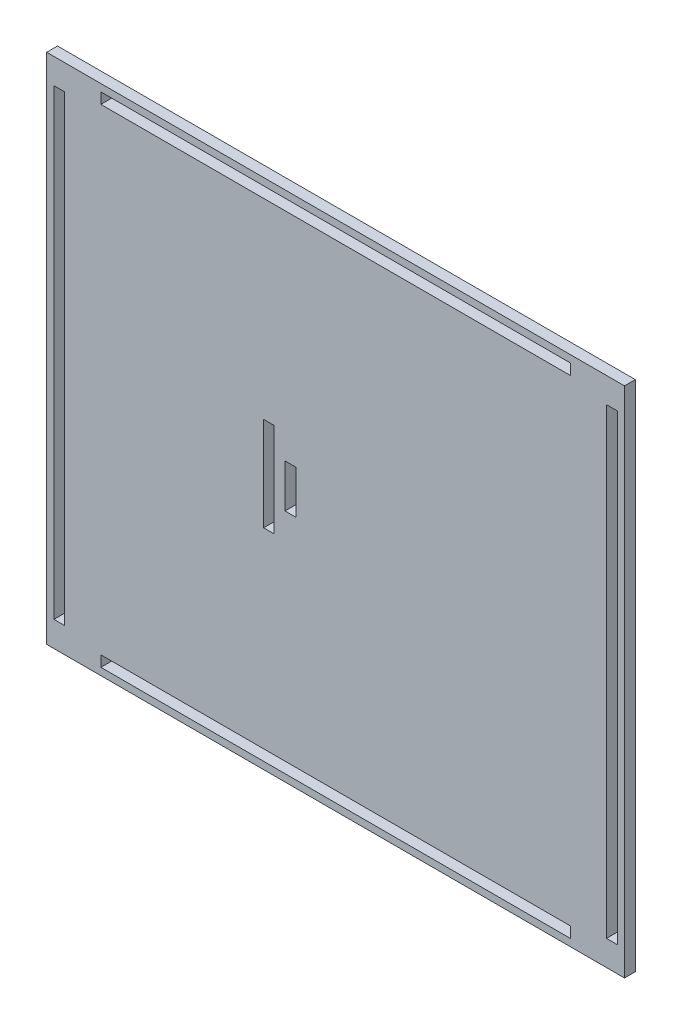
ISO-10303-21;
HEADER;
FILE_DESCRIPTION(('STEP AP214'),'2;1');
FILE_NAME('part.step','',(''),(''),'','','');
FILE_SCHEMA(('AUTOMOTIVE_DESIGN { 1 0 10303 214 1 1 1 1 }'));
ENDSEC;
DATA;
#1=APPLICATION_CONTEXT('core data for automotive mechanical design processes');
#2=APPLICATION_PROTOCOL_DEFINITION('international standard','automotive_design',2000,#1);
#3=PRODUCT_CONTEXT('',#1,'mechanical');
#4=PRODUCT('Part','Part','',(#3));
#5=PRODUCT_RELATED_PRODUCT_CATEGORY('part','',(#4));
#6=PRODUCT_DEFINITION_FORMATION('','',#4);
#7=PRODUCT_DEFINITION_CONTEXT('part definition',#1,'design');
#8=PRODUCT_DEFINITION('design','',#6,#7);
#9=PRODUCT_DEFINITION_SHAPE('','',#8);
#10=(LENGTH_UNIT() NAMED_UNIT(*) SI_UNIT(.MILLI.,.METRE.));
#11=(NAMED_UNIT(*) PLANE_ANGLE_UNIT() SI_UNIT($,.RADIAN.));
#12=(NAMED_UNIT(*) SI_UNIT($,.STERADIAN.) SOLID_ANGLE_UNIT());
#13=UNCERTAINTY_MEASURE_WITH_UNIT(LENGTH_MEASURE(1.E-05),#10,'distance_accuracy_value','');
#14=(GEOMETRIC_REPRESENTATION_CONTEXT(3) GLOBAL_UNCERTAINTY_ASSIGNED_CONTEXT((#13)) GLOBAL_UNIT_ASSIGNED_CONTEXT((#10,
#11,#12)) REPRESENTATION_CONTEXT('',''));
#15=CARTESIAN_POINT('',(0.,0.,0.));
#16=DIRECTION('',(0.,0.,1.));
#17=DIRECTION('',(1.,0.,0.));
#18=AXIS2_PLACEMENT_3D('',#15,#16,#17);
#19=CARTESIAN_POINT('',(0.,0.,3.));
#20=DIRECTION('',(0.,0.,1.));
#21=DIRECTION('',(1.,0.,0.));
#22=AXIS2_PLACEMENT_3D('',#19,#20,#21);
#23=PLANE('',#22);
#24=DIRECTION('',(0.,-1.,0.));
#25=VECTOR('',#24,1.);
#26=CARTESIAN_POINT('',(-78.225474185451,39.1132477538768,3.));
#27=LINE('',#26,#25);
#28=CARTESIAN_POINT('',(-78.225474185451,39.1132477538768,3.));
#29=VERTEX_POINT('',#28);
#30=CARTESIAN_POINT('',(-78.225474185451,-102.886752246123,3.));
#31=VERTEX_POINT('',#30);
#32=EDGE_CURVE('E411',#29,#31,#27,.T.);
#33=ORIENTED_EDGE('',*,*,#32,.T.);
#34=DIRECTION('',(1.,0.,0.));
#35=VECTOR('',#34,1.);
#36=CARTESIAN_POINT('',(-78.225474185451,-102.886752246123,3.));
#37=LINE('',#36,#35);
#38=CARTESIAN_POINT('',(81.7745258145491,-102.886752246123,3.));
#39=VERTEX_POINT('',#38);
#40=EDGE_CURVE('E414',#31,#39,#37,.T.);
#41=ORIENTED_EDGE('',*,*,#40,.T.);
#42=DIRECTION('',(0.,1.,0.));
#43=VECTOR('',#42,1.);
#44=CARTESIAN_POINT('',(81.774525814549,39.1132477538768,3.));
#45=LINE('',#44,#43);
#46=CARTESIAN_POINT('',(81.774525814549,39.1132477538768,3.));
#47=VERTEX_POINT('',#46);
#48=EDGE_CURVE('E417',#39,#47,#45,.T.);
#49=ORIENTED_EDGE('',*,*,#48,.T.);
#50=DIRECTION('',(-1.,0.,0.));
#51=VECTOR('',#50,1.);
#52=CARTESIAN_POINT('',(-78.225474185451,39.1132477538768,3.));
#53=LINE('',#52,#51);
#54=EDGE_CURVE('E419',#47,#29,#53,.T.);
#55=ORIENTED_EDGE('',*,*,#54,.T.);
#56=EDGE_LOOP('',(#33,#41,#49,#55));
#57=FACE_BOUND('',#56,.T.);
#58=DIRECTION('',(1.,0.,0.));
#59=VECTOR('',#58,1.);
#60=CARTESIAN_POINT('',(-63.225474185451,34.1132477538768,3.));
#61=LINE('',#60,#59);
#62=CARTESIAN_POINT('',(-63.225474185451,34.1132477538768,3.));
#63=VERTEX_POINT('',#62);
#64=CARTESIAN_POINT('',(66.774525814549,34.1132477538768,3.));
#65=VERTEX_POINT('',#64);
#66=EDGE_CURVE('E382',#63,#65,#61,.T.);
#67=ORIENTED_EDGE('',*,*,#66,.F.);
#68=DIRECTION('',(0.,-1.,0.));
#69=VECTOR('',#68,1.);
#70=CARTESIAN_POINT('',(-63.225474185451,37.1132477538768,3.));
#71=LINE('',#70,#69);
#72=CARTESIAN_POINT('',(-63.225474185451,37.1132477538768,3.));
#73=VERTEX_POINT('',#72);
#74=EDGE_CURVE('E380',#73,#63,#71,.T.);
#75=ORIENTED_EDGE('',*,*,#74,.F.);
#76=DIRECTION('',(-1.,0.,0.));
#77=VECTOR('',#76,1.);
#78=CARTESIAN_POINT('',(-63.225474185451,37.1132477538768,3.));
#79=LINE('',#78,#77);
#80=CARTESIAN_POINT('',(66.774525814549,37.1132477538768,3.));
#81=VERTEX_POINT('',#80);
#82=EDGE_CURVE('E388',#81,#73,#79,.T.);
#83=ORIENTED_EDGE('',*,*,#82,.F.);
#84=DIRECTION('',(0.,1.,0.));
#85=VECTOR('',#84,1.);
#86=CARTESIAN_POINT('',(66.774525814549,37.1132477538768,3.));
#87=LINE('',#86,#85);
#88=EDGE_CURVE('E385',#65,#81,#87,.T.);
#89=ORIENTED_EDGE('',*,*,#88,.F.);
#90=EDGE_LOOP('',(#67,#75,#83,#89));
#91=FACE_BOUND('',#90,.T.);
#92=DIRECTION('',(1.,0.,0.));
#93=VECTOR('',#92,1.);
#94=CARTESIAN_POINT('',(-63.225474185451,-100.886752246123,3.));
#95=LINE('',#94,#93);
#96=CARTESIAN_POINT('',(-63.225474185451,-100.886752246123,3.));
#97=VERTEX_POINT('',#96);
#98=CARTESIAN_POINT('',(66.774525814549,-100.886752246123,3.));
#99=VERTEX_POINT('',#98);
#100=EDGE_CURVE('E351',#97,#99,#95,.T.);
#101=ORIENTED_EDGE('',*,*,#100,.F.);
#102=DIRECTION('',(0.,-1.,0.));
#103=VECTOR('',#102,1.);
#104=CARTESIAN_POINT('',(-63.225474185451,-100.886752246123,3.));
#105=LINE('',#104,#103);
#106=CARTESIAN_POINT('',(-63.225474185451,-97.8867522461232,3.));
#107=VERTEX_POINT('',#106);
#108=EDGE_CURVE('E349',#107,#97,#105,.T.);
#109=ORIENTED_EDGE('',*,*,#108,.F.);
#110=DIRECTION('',(-1.,0.,0.));
#111=VECTOR('',#110,1.);
#112=CARTESIAN_POINT('',(-63.225474185451,-97.8867522461232,3.));
#113=LINE('',#112,#111);
#114=CARTESIAN_POINT('',(66.774525814549,-97.8867522461232,3.));
#115=VERTEX_POINT('',#114);
#116=EDGE_CURVE('E357',#115,#107,#113,.T.);
#117=ORIENTED_EDGE('',*,*,#116,.F.);
#118=DIRECTION('',(0.,1.,0.));
#119=VECTOR('',#118,1.);
#120=CARTESIAN_POINT('',(66.774525814549,-100.886752246123,3.));
#121=LINE('',#120,#119);
#122=EDGE_CURVE('E354',#99,#115,#121,.T.);
#123=ORIENTED_EDGE('',*,*,#122,.F.);
#124=EDGE_LOOP('',(#101,#109,#117,#123));
#125=FACE_BOUND('',#124,.T.);
#126=DIRECTION('',(1.,0.,0.));
#127=VECTOR('',#126,1.);
#128=CARTESIAN_POINT('',(-76.225474185451,-95.8867522461232,3.));
#129=LINE('',#128,#127);
#130=CARTESIAN_POINT('',(-76.225474185451,-95.8867522461232,3.));
#131=VERTEX_POINT('',#130);
#132=CARTESIAN_POINT('',(-73.225474185451,-95.8867522461232,3.));
#133=VERTEX_POINT('',#132);
#134=EDGE_CURVE('E320',#131,#133,#129,.T.);
#135=ORIENTED_EDGE('',*,*,#134,.F.);
#136=DIRECTION('',(0.,-1.,0.));
#137=VECTOR('',#136,1.);
#138=CARTESIAN_POINT('',(-76.225474185451,32.1132477538768,3.));
#139=LINE('',#138,#137);
#140=CARTESIAN_POINT('',(-76.225474185451,32.1132477538768,3.));
#141=VERTEX_POINT('',#140);
#142=EDGE_CURVE('E318',#141,#131,#139,.T.);
#143=ORIENTED_EDGE('',*,*,#142,.F.);
#144=DIRECTION('',(-1.,0.,0.));
#145=VECTOR('',#144,1.);
#146=CARTESIAN_POINT('',(-76.225474185451,32.1132477538768,3.));
#147=LINE('',#146,#145);
#148=CARTESIAN_POINT('',(-73.225474185451,32.1132477538768,3.));
#149=VERTEX_POINT('',#148);
#150=EDGE_CURVE('E326',#149,#141,#147,.T.);
#151=ORIENTED_EDGE('',*,*,#150,.F.);
#152=DIRECTION('',(0.,1.,0.));
#153=VECTOR('',#152,1.);
#154=CARTESIAN_POINT('',(-73.225474185451,32.1132477538768,3.));
#155=LINE('',#154,#153);
#156=EDGE_CURVE('E323',#133,#149,#155,.T.);
#157=ORIENTED_EDGE('',*,*,#156,.F.);
#158=EDGE_LOOP('',(#135,#143,#151,#157));
#159=FACE_BOUND('',#158,.T.);
#160=DIRECTION('',(-1.,0.,0.));
#161=VECTOR('',#160,1.);
#162=CARTESIAN_POINT('',(79.774525814549,32.1132477538773,3.));
#163=LINE('',#162,#161);
#164=CARTESIAN_POINT('',(79.774525814549,32.1132477538773,3.));
#165=VERTEX_POINT('',#164);
#166=CARTESIAN_POINT('',(76.7745258145564,32.1132477538773,3.));
#167=VERTEX_POINT('',#166);
#168=EDGE_CURVE('E289',#165,#167,#163,.T.);
#169=ORIENTED_EDGE('',*,*,#168,.F.);
#170=DIRECTION('',(0.,1.,0.));
#171=VECTOR('',#170,1.);
#172=CARTESIAN_POINT('',(79.774525814549,32.1132477538773,3.));
#173=LINE('',#172,#171);
#174=CARTESIAN_POINT('',(79.774525814549,-95.8867522461226,3.));
#175=VERTEX_POINT('',#174);
#176=EDGE_CURVE('E287',#175,#165,#173,.T.);
#177=ORIENTED_EDGE('',*,*,#176,.F.);
#178=DIRECTION('',(1.,0.,0.));
#179=VECTOR('',#178,1.);
#180=CARTESIAN_POINT('',(79.774525814549,-95.8867522461226,3.));
#181=LINE('',#180,#179);
#182=CARTESIAN_POINT('',(76.7745258145564,-95.8867522461226,3.));
#183=VERTEX_POINT('',#182);
#184=EDGE_CURVE('E295',#183,#175,#181,.T.);
#185=ORIENTED_EDGE('',*,*,#184,.F.);
#186=DIRECTION('',(0.,-1.,0.));
#187=VECTOR('',#186,1.);
#188=CARTESIAN_POINT('',(76.7745258145564,32.1132477538773,3.));
#189=LINE('',#188,#187);
#190=EDGE_CURVE('E292',#167,#183,#189,.T.);
#191=ORIENTED_EDGE('',*,*,#190,.F.);
#192=EDGE_LOOP('',(#169,#177,#185,#191));
#193=FACE_BOUND('',#192,.T.);
#194=DIRECTION('',(1.,0.,0.));
#195=VECTOR('',#194,1.);
#196=CARTESIAN_POINT('',(-18.1451342269902,-44.8867522461232,3.));
#197=LINE('',#196,#195);
#198=CARTESIAN_POINT('',(-18.1451342269902,-44.8867522461232,3.));
#199=VERTEX_POINT('',#198);
#200=CARTESIAN_POINT('',(-15.225474185451,-44.8867522461232,3.));
#201=VERTEX_POINT('',#200);
#202=EDGE_CURVE('E258',#199,#201,#197,.T.);
#203=ORIENTED_EDGE('',*,*,#202,.F.);
#204=DIRECTION('',(0.,-1.,0.));
#205=VECTOR('',#204,1.);
#206=CARTESIAN_POINT('',(-18.1451342269902,-18.8867522461232,3.));
#207=LINE('',#206,#205);
#208=CARTESIAN_POINT('',(-18.1451342269902,-18.8867522461232,3.));
#209=VERTEX_POINT('',#208);
#210=EDGE_CURVE('E256',#209,#199,#207,.T.);
#211=ORIENTED_EDGE('',*,*,#210,.F.);
#212=DIRECTION('',(-1.,0.,0.));
#213=VECTOR('',#212,1.);
#214=CARTESIAN_POINT('',(-18.1451342269902,-18.8867522461232,3.));
#215=LINE('',#214,#213);
#216=CARTESIAN_POINT('',(-15.225474185451,-18.8867522461232,3.));
#217=VERTEX_POINT('',#216);
#218=EDGE_CURVE('E264',#217,#209,#215,.T.);
#219=ORIENTED_EDGE('',*,*,#218,.F.);
#220=DIRECTION('',(0.,1.,0.));
#221=VECTOR('',#220,1.);
#222=CARTESIAN_POINT('',(-15.225474185451,-18.8867522461232,3.));
#223=LINE('',#222,#221);
#224=EDGE_CURVE('E261',#201,#217,#223,.T.);
#225=ORIENTED_EDGE('',*,*,#224,.F.);
#226=EDGE_LOOP('',(#203,#211,#219,#225));
#227=FACE_BOUND('',#226,.T.);
#228=DIRECTION('',(1.,0.,0.));
#229=VECTOR('',#228,1.);
#230=CARTESIAN_POINT('',(-12.225474185451,-37.8867522461232,3.));
#231=LINE('',#230,#229);
#232=CARTESIAN_POINT('',(-12.225474185451,-37.8867522461232,3.));
#233=VERTEX_POINT('',#232);
#234=CARTESIAN_POINT('',(-9.22547418545098,-37.8867522461232,3.));
#235=VERTEX_POINT('',#234);
#236=EDGE_CURVE('E228',#233,#235,#231,.T.);
#237=ORIENTED_EDGE('',*,*,#236,.F.);
#238=DIRECTION('',(0.,-1.,0.));
#239=VECTOR('',#238,1.);
#240=CARTESIAN_POINT('',(-12.225474185451,-25.8867522461232,3.));
#241=LINE('',#240,#239);
#242=CARTESIAN_POINT('',(-12.225474185451,-25.8867522461232,3.));
#243=VERTEX_POINT('',#242);
#244=EDGE_CURVE('E220',#243,#233,#241,.T.);
#245=ORIENTED_EDGE('',*,*,#244,.F.);
#246=DIRECTION('',(-1.,0.,0.));
#247=VECTOR('',#246,1.);
#248=CARTESIAN_POINT('',(-12.225474185451,-25.8867522461232,3.));
#249=LINE('',#248,#247);
#250=CARTESIAN_POINT('',(-9.22547418545098,-25.8867522461232,3.));
#251=VERTEX_POINT('',#250);
#252=EDGE_CURVE('E242',#251,#243,#249,.T.);
#253=ORIENTED_EDGE('',*,*,#252,.F.);
#254=DIRECTION('',(0.,1.,0.));
#255=VECTOR('',#254,1.);
#256=CARTESIAN_POINT('',(-9.22547418545098,-25.8867522461232,3.));
#257=LINE('',#256,#255);
#258=EDGE_CURVE('E240',#235,#251,#257,.T.);
#259=ORIENTED_EDGE('',*,*,#258,.F.);
#260=EDGE_LOOP('',(#237,#245,#253,#259));
#261=FACE_BOUND('',#260,.T.);
#262=ADVANCED_FACE('F35',(#57,#91,#125,#159,#193,#227,#261),#23,.T.);
#263=CARTESIAN_POINT('',(0.,0.,0.));
#264=DIRECTION('',(0.,0.,1.));
#265=DIRECTION('',(1.,0.,0.));
#266=AXIS2_PLACEMENT_3D('',#263,#264,#265);
#267=PLANE('',#266);
#268=DIRECTION('',(0.,-1.,0.));
#269=VECTOR('',#268,1.);
#270=CARTESIAN_POINT('',(-18.1451342269902,-18.8867522461232,0.));
#271=LINE('',#270,#269);
#272=CARTESIAN_POINT('',(-18.1451342269902,-18.8867522461232,0.));
#273=VERTEX_POINT('',#272);
#274=CARTESIAN_POINT('',(-18.1451342269902,-44.8867522461232,0.));
#275=VERTEX_POINT('',#274);
#276=EDGE_CURVE('E236',#273,#275,#271,.T.);
#277=ORIENTED_EDGE('',*,*,#276,.T.);
#278=DIRECTION('',(1.,0.,0.));
#279=VECTOR('',#278,1.);
#280=CARTESIAN_POINT('',(-18.1451342269902,-44.8867522461232,0.));
#281=LINE('',#280,#279);
#282=CARTESIAN_POINT('',(-15.225474185451,-44.8867522461232,0.));
#283=VERTEX_POINT('',#282);
#284=EDGE_CURVE('E269',#275,#283,#281,.T.);
#285=ORIENTED_EDGE('',*,*,#284,.T.);
#286=DIRECTION('',(0.,1.,0.));
#287=VECTOR('',#286,1.);
#288=CARTESIAN_POINT('',(-15.225474185451,-18.8867522461232,0.));
#289=LINE('',#288,#287);
#290=CARTESIAN_POINT('',(-15.225474185451,-18.8867522461232,0.));
#291=VERTEX_POINT('',#290);
#292=EDGE_CURVE('E272',#283,#291,#289,.T.);
#293=ORIENTED_EDGE('',*,*,#292,.T.);
#294=DIRECTION('',(-1.,0.,0.));
#295=VECTOR('',#294,1.);
#296=CARTESIAN_POINT('',(-18.1451342269902,-18.8867522461232,0.));
#297=LINE('',#296,#295);
#298=EDGE_CURVE('E259',#291,#273,#297,.T.);
#299=ORIENTED_EDGE('',*,*,#298,.T.);
#300=EDGE_LOOP('',(#277,#285,#293,#299));
#301=FACE_BOUND('',#300,.T.);
#302=DIRECTION('',(0.,-1.,0.));
#303=VECTOR('',#302,1.);
#304=CARTESIAN_POINT('',(-76.225474185451,32.1132477538768,0.));
#305=LINE('',#304,#303);
#306=CARTESIAN_POINT('',(-76.225474185451,32.1132477538768,0.));
#307=VERTEX_POINT('',#306);
#308=CARTESIAN_POINT('',(-76.225474185451,-95.8867522461232,0.));
#309=VERTEX_POINT('',#308);
#310=EDGE_CURVE('E317',#307,#309,#305,.T.);
#311=ORIENTED_EDGE('',*,*,#310,.T.);
#312=DIRECTION('',(1.,0.,0.));
#313=VECTOR('',#312,1.);
#314=CARTESIAN_POINT('',(-76.225474185451,-95.8867522461232,0.));
#315=LINE('',#314,#313);
#316=CARTESIAN_POINT('',(-73.225474185451,-95.8867522461232,0.));
#317=VERTEX_POINT('',#316);
#318=EDGE_CURVE('E331',#309,#317,#315,.T.);
#319=ORIENTED_EDGE('',*,*,#318,.T.);
#320=DIRECTION('',(0.,1.,0.));
#321=VECTOR('',#320,1.);
#322=CARTESIAN_POINT('',(-73.225474185451,32.1132477538768,0.));
#323=LINE('',#322,#321);
#324=CARTESIAN_POINT('',(-73.225474185451,32.1132477538768,0.));
#325=VERTEX_POINT('',#324);
#326=EDGE_CURVE('E334',#317,#325,#323,.T.);
#327=ORIENTED_EDGE('',*,*,#326,.T.);
#328=DIRECTION('',(-1.,0.,0.));
#329=VECTOR('',#328,1.);
#330=CARTESIAN_POINT('',(-76.225474185451,32.1132477538768,0.));
#331=LINE('',#330,#329);
#332=EDGE_CURVE('E321',#325,#307,#331,.T.);
#333=ORIENTED_EDGE('',*,*,#332,.T.);
#334=EDGE_LOOP('',(#311,#319,#327,#333));
#335=FACE_BOUND('',#334,.T.);
#336=DIRECTION('',(0.,-1.,0.));
#337=VECTOR('',#336,1.);
#338=CARTESIAN_POINT('',(-63.225474185451,37.1132477538768,0.));
#339=LINE('',#338,#337);
#340=CARTESIAN_POINT('',(-63.225474185451,37.1132477538768,0.));
#341=VERTEX_POINT('',#340);
#342=CARTESIAN_POINT('',(-63.225474185451,34.1132477538768,0.));
#343=VERTEX_POINT('',#342);
#344=EDGE_CURVE('E379',#341,#343,#339,.T.);
#345=ORIENTED_EDGE('',*,*,#344,.T.);
#346=DIRECTION('',(1.,0.,0.));
#347=VECTOR('',#346,1.);
#348=CARTESIAN_POINT('',(-63.225474185451,34.1132477538768,0.));
#349=LINE('',#348,#347);
#350=CARTESIAN_POINT('',(66.774525814549,34.1132477538768,0.));
#351=VERTEX_POINT('',#350);
#352=EDGE_CURVE('E393',#343,#351,#349,.T.);
#353=ORIENTED_EDGE('',*,*,#352,.T.);
#354=DIRECTION('',(0.,1.,0.));
#355=VECTOR('',#354,1.);
#356=CARTESIAN_POINT('',(66.774525814549,37.1132477538768,0.));
#357=LINE('',#356,#355);
#358=CARTESIAN_POINT('',(66.774525814549,37.1132477538768,0.));
#359=VERTEX_POINT('',#358);
#360=EDGE_CURVE('E396',#351,#359,#357,.T.);
#361=ORIENTED_EDGE('',*,*,#360,.T.);
#362=DIRECTION('',(-1.,0.,0.));
#363=VECTOR('',#362,1.);
#364=CARTESIAN_POINT('',(-63.225474185451,37.1132477538768,0.));
#365=LINE('',#364,#363);
#366=EDGE_CURVE('E383',#359,#341,#365,.T.);
#367=ORIENTED_EDGE('',*,*,#366,.T.);
#368=EDGE_LOOP('',(#345,#353,#361,#367));
#369=FACE_BOUND('',#368,.T.);
#370=DIRECTION('',(0.,-1.,0.));
#371=VECTOR('',#370,1.);
#372=CARTESIAN_POINT('',(-78.225474185451,39.1132477538768,0.));
#373=LINE('',#372,#371);
#374=CARTESIAN_POINT('',(-78.225474185451,39.1132477538768,0.));
#375=VERTEX_POINT('',#374);
#376=CARTESIAN_POINT('',(-78.225474185451,-102.886752246123,0.));
#377=VERTEX_POINT('',#376);
#378=EDGE_CURVE('E410',#375,#377,#373,.T.);
#379=ORIENTED_EDGE('',*,*,#378,.F.);
#380=DIRECTION('',(-1.,0.,0.));
#381=VECTOR('',#380,1.);
#382=CARTESIAN_POINT('',(-78.225474185451,39.1132477538768,0.));
#383=LINE('',#382,#381);
#384=CARTESIAN_POINT('',(81.774525814549,39.1132477538768,0.));
#385=VERTEX_POINT('',#384);
#386=EDGE_CURVE('E415',#385,#375,#383,.T.);
#387=ORIENTED_EDGE('',*,*,#386,.F.);
#388=DIRECTION('',(0.,1.,0.));
#389=VECTOR('',#388,1.);
#390=CARTESIAN_POINT('',(81.774525814549,39.1132477538768,0.));
#391=LINE('',#390,#389);
#392=CARTESIAN_POINT('',(81.7745258145491,-102.886752246123,0.));
#393=VERTEX_POINT('',#392);
#394=EDGE_CURVE('E426',#393,#385,#391,.T.);
#395=ORIENTED_EDGE('',*,*,#394,.F.);
#396=DIRECTION('',(1.,0.,0.));
#397=VECTOR('',#396,1.);
#398=CARTESIAN_POINT('',(-78.225474185451,-102.886752246123,0.));
#399=LINE('',#398,#397);
#400=EDGE_CURVE('E424',#377,#393,#399,.T.);
#401=ORIENTED_EDGE('',*,*,#400,.F.);
#402=EDGE_LOOP('',(#379,#387,#395,#401));
#403=FACE_BOUND('',#402,.T.);
#404=DIRECTION('',(0.,-1.,0.));
#405=VECTOR('',#404,1.);
#406=CARTESIAN_POINT('',(-63.225474185451,-100.886752246123,0.));
#407=LINE('',#406,#405);
#408=CARTESIAN_POINT('',(-63.225474185451,-97.8867522461232,0.));
#409=VERTEX_POINT('',#408);
#410=CARTESIAN_POINT('',(-63.225474185451,-100.886752246123,0.));
#411=VERTEX_POINT('',#410);
#412=EDGE_CURVE('E348',#409,#411,#407,.T.);
#413=ORIENTED_EDGE('',*,*,#412,.T.);
#414=DIRECTION('',(1.,0.,0.));
#415=VECTOR('',#414,1.);
#416=CARTESIAN_POINT('',(-63.225474185451,-100.886752246123,0.));
#417=LINE('',#416,#415);
#418=CARTESIAN_POINT('',(66.774525814549,-100.886752246123,0.));
#419=VERTEX_POINT('',#418);
#420=EDGE_CURVE('E362',#411,#419,#417,.T.);
#421=ORIENTED_EDGE('',*,*,#420,.T.);
#422=DIRECTION('',(0.,1.,0.));
#423=VECTOR('',#422,1.);
#424=CARTESIAN_POINT('',(66.774525814549,-100.886752246123,0.));
#425=LINE('',#424,#423);
#426=CARTESIAN_POINT('',(66.774525814549,-97.8867522461232,0.));
#427=VERTEX_POINT('',#426);
#428=EDGE_CURVE('E365',#419,#427,#425,.T.);
#429=ORIENTED_EDGE('',*,*,#428,.T.);
#430=DIRECTION('',(-1.,0.,0.));
#431=VECTOR('',#430,1.);
#432=CARTESIAN_POINT('',(-63.225474185451,-97.8867522461232,0.));
#433=LINE('',#432,#431);
#434=EDGE_CURVE('E352',#427,#409,#433,.T.);
#435=ORIENTED_EDGE('',*,*,#434,.T.);
#436=EDGE_LOOP('',(#413,#421,#429,#435));
#437=FACE_BOUND('',#436,.T.);
#438=DIRECTION('',(0.,1.,0.));
#439=VECTOR('',#438,1.);
#440=CARTESIAN_POINT('',(79.774525814549,32.1132477538773,0.));
#441=LINE('',#440,#439);
#442=CARTESIAN_POINT('',(79.774525814549,-95.8867522461226,0.));
#443=VERTEX_POINT('',#442);
#444=CARTESIAN_POINT('',(79.774525814549,32.1132477538773,0.));
#445=VERTEX_POINT('',#444);
#446=EDGE_CURVE('E286',#443,#445,#441,.T.);
#447=ORIENTED_EDGE('',*,*,#446,.T.);
#448=DIRECTION('',(-1.,0.,0.));
#449=VECTOR('',#448,1.);
#450=CARTESIAN_POINT('',(79.774525814549,32.1132477538773,0.));
#451=LINE('',#450,#449);
#452=CARTESIAN_POINT('',(76.7745258145564,32.1132477538773,0.));
#453=VERTEX_POINT('',#452);
#454=EDGE_CURVE('E300',#445,#453,#451,.T.);
#455=ORIENTED_EDGE('',*,*,#454,.T.);
#456=DIRECTION('',(0.,-1.,0.));
#457=VECTOR('',#456,1.);
#458=CARTESIAN_POINT('',(76.7745258145564,32.1132477538773,0.));
#459=LINE('',#458,#457);
#460=CARTESIAN_POINT('',(76.7745258145564,-95.8867522461226,0.));
#461=VERTEX_POINT('',#460);
#462=EDGE_CURVE('E303',#453,#461,#459,.T.);
#463=ORIENTED_EDGE('',*,*,#462,.T.);
#464=DIRECTION('',(1.,0.,0.));
#465=VECTOR('',#464,1.);
#466=CARTESIAN_POINT('',(79.774525814549,-95.8867522461226,0.));
#467=LINE('',#466,#465);
#468=EDGE_CURVE('E290',#461,#443,#467,.T.);
#469=ORIENTED_EDGE('',*,*,#468,.T.);
#470=EDGE_LOOP('',(#447,#455,#463,#469));
#471=FACE_BOUND('',#470,.T.);
#472=DIRECTION('',(0.,-1.,0.));
#473=VECTOR('',#472,1.);
#474=CARTESIAN_POINT('',(-12.225474185451,-25.8867522461232,0.));
#475=LINE('',#474,#473);
#476=CARTESIAN_POINT('',(-12.225474185451,-25.8867522461232,0.));
#477=VERTEX_POINT('',#476);
#478=CARTESIAN_POINT('',(-12.225474185451,-37.8867522461232,0.));
#479=VERTEX_POINT('',#478);
#480=EDGE_CURVE('E58',#477,#479,#475,.T.);
#481=ORIENTED_EDGE('',*,*,#480,.T.);
#482=DIRECTION('',(1.,0.,0.));
#483=VECTOR('',#482,1.);
#484=CARTESIAN_POINT('',(-12.225474185451,-37.8867522461232,0.));
#485=LINE('',#484,#483);
#486=CARTESIAN_POINT('',(-9.22547418545098,-37.8867522461232,0.));
#487=VERTEX_POINT('',#486);
#488=EDGE_CURVE('E235',#479,#487,#485,.T.);
#489=ORIENTED_EDGE('',*,*,#488,.T.);
#490=DIRECTION('',(0.,1.,0.));
#491=VECTOR('',#490,1.);
#492=CARTESIAN_POINT('',(-9.22547418545098,-25.8867522461232,0.));
#493=LINE('',#492,#491);
#494=CARTESIAN_POINT('',(-9.22547418545098,-25.8867522461232,0.));
#495=VERTEX_POINT('',#494);
#496=EDGE_CURVE('E248',#487,#495,#493,.T.);
#497=ORIENTED_EDGE('',*,*,#496,.T.);
#498=DIRECTION('',(-1.,0.,0.));
#499=VECTOR('',#498,1.);
#500=CARTESIAN_POINT('',(-12.225474185451,-25.8867522461232,0.));
#501=LINE('',#500,#499);
#502=EDGE_CURVE('E229',#495,#477,#501,.T.);
#503=ORIENTED_EDGE('',*,*,#502,.T.);
#504=EDGE_LOOP('',(#481,#489,#497,#503));
#505=FACE_BOUND('',#504,.T.);
#506=ADVANCED_FACE('F444',(#301,#335,#369,#403,#437,#471,#505),#267,.F.);
#507=CARTESIAN_POINT('',(-78.225474185451,39.1132477538768,3.));
#508=DIRECTION('',(1.,0.,0.));
#509=DIRECTION('',(0.,1.,0.));
#510=AXIS2_PLACEMENT_3D('',#507,#508,#509);
#511=PLANE('',#510);
#512=ORIENTED_EDGE('',*,*,#378,.T.);
#513=DIRECTION('',(0.,0.,-1.));
#514=VECTOR('',#513,1.);
#515=CARTESIAN_POINT('',(-78.225474185451,-102.886752246123,3.));
#516=LINE('',#515,#514);
#517=EDGE_CURVE('E11',#31,#377,#516,.T.);
#518=ORIENTED_EDGE('',*,*,#517,.F.);
#519=ORIENTED_EDGE('',*,*,#32,.F.);
#520=DIRECTION('',(0.,0.,-1.));
#521=VECTOR('',#520,1.);
#522=CARTESIAN_POINT('',(-78.225474185451,39.1132477538768,3.));
#523=LINE('',#522,#521);
#524=EDGE_CURVE('E421',#29,#375,#523,.T.);
#525=ORIENTED_EDGE('',*,*,#524,.T.);
#526=EDGE_LOOP('',(#512,#518,#519,#525));
#527=FACE_BOUND('',#526,.T.);
#528=ADVANCED_FACE('F37',(#527),#511,.F.);
#529=CARTESIAN_POINT('',(-78.225474185451,-102.886752246123,3.));
#530=DIRECTION('',(0.,1.,0.));
#531=DIRECTION('',(0.,0.,1.));
#532=AXIS2_PLACEMENT_3D('',#529,#530,#531);
#533=PLANE('',#532);
#534=ORIENTED_EDGE('',*,*,#400,.T.);
#535=DIRECTION('',(0.,0.,-1.));
#536=VECTOR('',#535,1.);
#537=CARTESIAN_POINT('',(81.7745258145491,-102.886752246123,3.));
#538=LINE('',#537,#536);
#539=EDGE_CURVE('E43',#39,#393,#538,.T.);
#540=ORIENTED_EDGE('',*,*,#539,.F.);
#541=ORIENTED_EDGE('',*,*,#40,.F.);
#542=ORIENTED_EDGE('',*,*,#517,.T.);
#543=EDGE_LOOP('',(#534,#540,#541,#542));
#544=FACE_BOUND('',#543,.T.);
#545=ADVANCED_FACE('F455',(#544),#533,.F.);
#546=CARTESIAN_POINT('',(81.774525814549,39.1132477538768,3.));
#547=DIRECTION('',(-1.,0.,0.));
#548=DIRECTION('',(0.,-1.,0.));
#549=AXIS2_PLACEMENT_3D('',#546,#547,#548);
#550=PLANE('',#549);
#551=ORIENTED_EDGE('',*,*,#394,.T.);
#552=DIRECTION('',(0.,0.,-1.));
#553=VECTOR('',#552,1.);
#554=CARTESIAN_POINT('',(81.774525814549,39.1132477538768,3.));
#555=LINE('',#554,#553);
#556=EDGE_CURVE('E431',#47,#385,#555,.T.);
#557=ORIENTED_EDGE('',*,*,#556,.F.);
#558=ORIENTED_EDGE('',*,*,#48,.F.);
#559=ORIENTED_EDGE('',*,*,#539,.T.);
#560=EDGE_LOOP('',(#551,#557,#558,#559));
#561=FACE_BOUND('',#560,.T.);
#562=ADVANCED_FACE('F438',(#561),#550,.F.);
#563=CARTESIAN_POINT('',(-78.225474185451,39.1132477538768,3.));
#564=DIRECTION('',(0.,-1.,0.));
#565=DIRECTION('',(1.,0.,0.));
#566=AXIS2_PLACEMENT_3D('',#563,#564,#565);
#567=PLANE('',#566);
#568=ORIENTED_EDGE('',*,*,#386,.T.);
#569=ORIENTED_EDGE('',*,*,#524,.F.);
#570=ORIENTED_EDGE('',*,*,#54,.F.);
#571=ORIENTED_EDGE('',*,*,#556,.T.);
#572=EDGE_LOOP('',(#568,#569,#570,#571));
#573=FACE_BOUND('',#572,.T.);
#574=ADVANCED_FACE('F448',(#573),#567,.F.);
#575=CARTESIAN_POINT('',(-63.225474185451,37.1132477538768,3.));
#576=DIRECTION('',(1.,0.,0.));
#577=DIRECTION('',(0.,0.,-1.));
#578=AXIS2_PLACEMENT_3D('',#575,#576,#577);
#579=PLANE('',#578);
#580=ORIENTED_EDGE('',*,*,#344,.F.);
#581=DIRECTION('',(0.,0.,-1.));
#582=VECTOR('',#581,1.);
#583=CARTESIAN_POINT('',(-63.225474185451,37.1132477538768,3.));
#584=LINE('',#583,#582);
#585=EDGE_CURVE('E390',#73,#341,#584,.T.);
#586=ORIENTED_EDGE('',*,*,#585,.F.);
#587=ORIENTED_EDGE('',*,*,#74,.T.);
#588=DIRECTION('',(0.,0.,-1.));
#589=VECTOR('',#588,1.);
#590=CARTESIAN_POINT('',(-63.225474185451,34.1132477538768,3.));
#591=LINE('',#590,#589);
#592=EDGE_CURVE('E407',#63,#343,#591,.T.);
#593=ORIENTED_EDGE('',*,*,#592,.T.);
#594=EDGE_LOOP('',(#580,#586,#587,#593));
#595=FACE_BOUND('',#594,.T.);
#596=ADVANCED_FACE('F470',(#595),#579,.T.);
#597=CARTESIAN_POINT('',(-63.225474185451,34.1132477538768,3.));
#598=DIRECTION('',(0.,1.,0.));
#599=DIRECTION('',(0.,0.,1.));
#600=AXIS2_PLACEMENT_3D('',#597,#598,#599);
#601=PLANE('',#600);
#602=ORIENTED_EDGE('',*,*,#352,.F.);
#603=ORIENTED_EDGE('',*,*,#592,.F.);
#604=ORIENTED_EDGE('',*,*,#66,.T.);
#605=DIRECTION('',(0.,0.,-1.));
#606=VECTOR('',#605,1.);
#607=CARTESIAN_POINT('',(66.774525814549,34.1132477538768,3.));
#608=LINE('',#607,#606);
#609=EDGE_CURVE('E405',#65,#351,#608,.T.);
#610=ORIENTED_EDGE('',*,*,#609,.T.);
#611=EDGE_LOOP('',(#602,#603,#604,#610));
#612=FACE_BOUND('',#611,.T.);
#613=ADVANCED_FACE('F477',(#612),#601,.T.);
#614=CARTESIAN_POINT('',(66.774525814549,37.1132477538768,3.));
#615=DIRECTION('',(-1.,0.,0.));
#616=DIRECTION('',(0.,0.,1.));
#617=AXIS2_PLACEMENT_3D('',#614,#615,#616);
#618=PLANE('',#617);
#619=ORIENTED_EDGE('',*,*,#360,.F.);
#620=ORIENTED_EDGE('',*,*,#609,.F.);
#621=ORIENTED_EDGE('',*,*,#88,.T.);
#622=DIRECTION('',(0.,0.,-1.));
#623=VECTOR('',#622,1.);
#624=CARTESIAN_POINT('',(66.774525814549,37.1132477538768,3.));
#625=LINE('',#624,#623);
#626=EDGE_CURVE('E403',#81,#359,#625,.T.);
#627=ORIENTED_EDGE('',*,*,#626,.T.);
#628=EDGE_LOOP('',(#619,#620,#621,#627));
#629=FACE_BOUND('',#628,.T.);
#630=ADVANCED_FACE('F482',(#629),#618,.T.);
#631=CARTESIAN_POINT('',(-63.225474185451,37.1132477538768,3.));
#632=DIRECTION('',(0.,-1.,0.));
#633=DIRECTION('',(1.,0.,0.));
#634=AXIS2_PLACEMENT_3D('',#631,#632,#633);
#635=PLANE('',#634);
#636=ORIENTED_EDGE('',*,*,#366,.F.);
#637=ORIENTED_EDGE('',*,*,#626,.F.);
#638=ORIENTED_EDGE('',*,*,#82,.T.);
#639=ORIENTED_EDGE('',*,*,#585,.T.);
#640=EDGE_LOOP('',(#636,#637,#638,#639));
#641=FACE_BOUND('',#640,.T.);
#642=ADVANCED_FACE('F490',(#641),#635,.T.);
#643=CARTESIAN_POINT('',(-63.225474185451,-100.886752246123,3.));
#644=DIRECTION('',(1.,0.,0.));
#645=DIRECTION('',(0.,0.,-1.));
#646=AXIS2_PLACEMENT_3D('',#643,#644,#645);
#647=PLANE('',#646);
#648=ORIENTED_EDGE('',*,*,#412,.F.);
#649=DIRECTION('',(0.,0.,-1.));
#650=VECTOR('',#649,1.);
#651=CARTESIAN_POINT('',(-63.225474185451,-97.8867522461232,3.));
#652=LINE('',#651,#650);
#653=EDGE_CURVE('E359',#107,#409,#652,.T.);
#654=ORIENTED_EDGE('',*,*,#653,.F.);
#655=ORIENTED_EDGE('',*,*,#108,.T.);
#656=DIRECTION('',(0.,0.,-1.));
#657=VECTOR('',#656,1.);
#658=CARTESIAN_POINT('',(-63.225474185451,-100.886752246123,3.));
#659=LINE('',#658,#657);
#660=EDGE_CURVE('E376',#97,#411,#659,.T.);
#661=ORIENTED_EDGE('',*,*,#660,.T.);
#662=EDGE_LOOP('',(#648,#654,#655,#661));
#663=FACE_BOUND('',#662,.T.);
#664=ADVANCED_FACE('F585',(#663),#647,.T.);
#665=CARTESIAN_POINT('',(-63.225474185451,-100.886752246123,3.));
#666=DIRECTION('',(0.,1.,0.));
#667=DIRECTION('',(0.,0.,1.));
#668=AXIS2_PLACEMENT_3D('',#665,#666,#667);
#669=PLANE('',#668);
#670=ORIENTED_EDGE('',*,*,#420,.F.);
#671=ORIENTED_EDGE('',*,*,#660,.F.);
#672=ORIENTED_EDGE('',*,*,#100,.T.);
#673=DIRECTION('',(0.,0.,-1.));
#674=VECTOR('',#673,1.);
#675=CARTESIAN_POINT('',(66.774525814549,-100.886752246123,3.));
#676=LINE('',#675,#674);
#677=EDGE_CURVE('E374',#99,#419,#676,.T.);
#678=ORIENTED_EDGE('',*,*,#677,.T.);
#679=EDGE_LOOP('',(#670,#671,#672,#678));
#680=FACE_BOUND('',#679,.T.);
#681=ADVANCED_FACE('F581',(#680),#669,.T.);
#682=CARTESIAN_POINT('',(66.774525814549,-100.886752246123,3.));
#683=DIRECTION('',(-1.,0.,0.));
#684=DIRECTION('',(0.,0.,1.));
#685=AXIS2_PLACEMENT_3D('',#682,#683,#684);
#686=PLANE('',#685);
#687=ORIENTED_EDGE('',*,*,#428,.F.);
#688=ORIENTED_EDGE('',*,*,#677,.F.);
#689=ORIENTED_EDGE('',*,*,#122,.T.);
#690=DIRECTION('',(0.,0.,-1.));
#691=VECTOR('',#690,1.);
#692=CARTESIAN_POINT('',(66.774525814549,-97.8867522461232,3.));
#693=LINE('',#692,#691);
#694=EDGE_CURVE('E372',#115,#427,#693,.T.);
#695=ORIENTED_EDGE('',*,*,#694,.T.);
#696=EDGE_LOOP('',(#687,#688,#689,#695));
#697=FACE_BOUND('',#696,.T.);
#698=ADVANCED_FACE('F577',(#697),#686,.T.);
#699=CARTESIAN_POINT('',(-63.225474185451,-97.8867522461232,3.));
#700=DIRECTION('',(0.,-1.,0.));
#701=DIRECTION('',(0.,0.,-1.));
#702=AXIS2_PLACEMENT_3D('',#699,#700,#701);
#703=PLANE('',#702);
#704=ORIENTED_EDGE('',*,*,#434,.F.);
#705=ORIENTED_EDGE('',*,*,#694,.F.);
#706=ORIENTED_EDGE('',*,*,#116,.T.);
#707=ORIENTED_EDGE('',*,*,#653,.T.);
#708=EDGE_LOOP('',(#704,#705,#706,#707));
#709=FACE_BOUND('',#708,.T.);
#710=ADVANCED_FACE('F573',(#709),#703,.T.);
#711=CARTESIAN_POINT('',(-76.225474185451,32.1132477538768,3.));
#712=DIRECTION('',(1.,0.,0.));
#713=DIRECTION('',(0.,1.,0.));
#714=AXIS2_PLACEMENT_3D('',#711,#712,#713);
#715=PLANE('',#714);
#716=ORIENTED_EDGE('',*,*,#310,.F.);
#717=DIRECTION('',(0.,0.,-1.));
#718=VECTOR('',#717,1.);
#719=CARTESIAN_POINT('',(-76.225474185451,32.1132477538768,3.));
#720=LINE('',#719,#718);
#721=EDGE_CURVE('E328',#141,#307,#720,.T.);
#722=ORIENTED_EDGE('',*,*,#721,.F.);
#723=ORIENTED_EDGE('',*,*,#142,.T.);
#724=DIRECTION('',(0.,0.,-1.));
#725=VECTOR('',#724,1.);
#726=CARTESIAN_POINT('',(-76.225474185451,-95.8867522461232,3.));
#727=LINE('',#726,#725);
#728=EDGE_CURVE('E345',#131,#309,#727,.T.);
#729=ORIENTED_EDGE('',*,*,#728,.T.);
#730=EDGE_LOOP('',(#716,#722,#723,#729));
#731=FACE_BOUND('',#730,.T.);
#732=ADVANCED_FACE('F569',(#731),#715,.T.);
#733=CARTESIAN_POINT('',(-76.225474185451,-95.8867522461232,3.));
#734=DIRECTION('',(0.,1.,0.));
#735=DIRECTION('',(0.,0.,1.));
#736=AXIS2_PLACEMENT_3D('',#733,#734,#735);
#737=PLANE('',#736);
#738=ORIENTED_EDGE('',*,*,#318,.F.);
#739=ORIENTED_EDGE('',*,*,#728,.F.);
#740=ORIENTED_EDGE('',*,*,#134,.T.);
#741=DIRECTION('',(0.,0.,-1.));
#742=VECTOR('',#741,1.);
#743=CARTESIAN_POINT('',(-73.225474185451,-95.8867522461232,3.));
#744=LINE('',#743,#742);
#745=EDGE_CURVE('E343',#133,#317,#744,.T.);
#746=ORIENTED_EDGE('',*,*,#745,.T.);
#747=EDGE_LOOP('',(#738,#739,#740,#746));
#748=FACE_BOUND('',#747,.T.);
#749=ADVANCED_FACE('F565',(#748),#737,.T.);
#750=CARTESIAN_POINT('',(-73.225474185451,32.1132477538768,3.));
#751=DIRECTION('',(-1.,0.,0.));
#752=DIRECTION('',(0.,0.,1.));
#753=AXIS2_PLACEMENT_3D('',#750,#751,#752);
#754=PLANE('',#753);
#755=ORIENTED_EDGE('',*,*,#326,.F.);
#756=ORIENTED_EDGE('',*,*,#745,.F.);
#757=ORIENTED_EDGE('',*,*,#156,.T.);
#758=DIRECTION('',(0.,0.,-1.));
#759=VECTOR('',#758,1.);
#760=CARTESIAN_POINT('',(-73.225474185451,32.1132477538768,3.));
#761=LINE('',#760,#759);
#762=EDGE_CURVE('E341',#149,#325,#761,.T.);
#763=ORIENTED_EDGE('',*,*,#762,.T.);
#764=EDGE_LOOP('',(#755,#756,#757,#763));
#765=FACE_BOUND('',#764,.T.);
#766=ADVANCED_FACE('F561',(#765),#754,.T.);
#767=CARTESIAN_POINT('',(-76.225474185451,32.1132477538768,3.));
#768=DIRECTION('',(0.,-1.,0.));
#769=DIRECTION('',(1.,0.,0.));
#770=AXIS2_PLACEMENT_3D('',#767,#768,#769);
#771=PLANE('',#770);
#772=ORIENTED_EDGE('',*,*,#332,.F.);
#773=ORIENTED_EDGE('',*,*,#762,.F.);
#774=ORIENTED_EDGE('',*,*,#150,.T.);
#775=ORIENTED_EDGE('',*,*,#721,.T.);
#776=EDGE_LOOP('',(#772,#773,#774,#775));
#777=FACE_BOUND('',#776,.T.);
#778=ADVANCED_FACE('F557',(#777),#771,.T.);
#779=CARTESIAN_POINT('',(79.774525814549,32.1132477538773,3.));
#780=DIRECTION('',(-1.,0.,0.));
#781=DIRECTION('',(0.,-1.,0.));
#782=AXIS2_PLACEMENT_3D('',#779,#780,#781);
#783=PLANE('',#782);
#784=ORIENTED_EDGE('',*,*,#446,.F.);
#785=DIRECTION('',(0.,0.,-1.));
#786=VECTOR('',#785,1.);
#787=CARTESIAN_POINT('',(79.774525814549,-95.8867522461226,3.));
#788=LINE('',#787,#786);
#789=EDGE_CURVE('E297',#175,#443,#788,.T.);
#790=ORIENTED_EDGE('',*,*,#789,.F.);
#791=ORIENTED_EDGE('',*,*,#176,.T.);
#792=DIRECTION('',(0.,0.,-1.));
#793=VECTOR('',#792,1.);
#794=CARTESIAN_POINT('',(79.774525814549,32.1132477538773,3.));
#795=LINE('',#794,#793);
#796=EDGE_CURVE('E314',#165,#445,#795,.T.);
#797=ORIENTED_EDGE('',*,*,#796,.T.);
#798=EDGE_LOOP('',(#784,#790,#791,#797));
#799=FACE_BOUND('',#798,.T.);
#800=ADVANCED_FACE('F553',(#799),#783,.T.);
#801=CARTESIAN_POINT('',(79.774525814549,32.1132477538773,3.));
#802=DIRECTION('',(0.,-1.,0.));
#803=DIRECTION('',(1.,0.,0.));
#804=AXIS2_PLACEMENT_3D('',#801,#802,#803);
#805=PLANE('',#804);
#806=ORIENTED_EDGE('',*,*,#454,.F.);
#807=ORIENTED_EDGE('',*,*,#796,.F.);
#808=ORIENTED_EDGE('',*,*,#168,.T.);
#809=DIRECTION('',(0.,0.,-1.));
#810=VECTOR('',#809,1.);
#811=CARTESIAN_POINT('',(76.7745258145564,32.1132477538773,3.));
#812=LINE('',#811,#810);
#813=EDGE_CURVE('E312',#167,#453,#812,.T.);
#814=ORIENTED_EDGE('',*,*,#813,.T.);
#815=EDGE_LOOP('',(#806,#807,#808,#814));
#816=FACE_BOUND('',#815,.T.);
#817=ADVANCED_FACE('F549',(#816),#805,.T.);
#818=CARTESIAN_POINT('',(76.7745258145564,32.1132477538773,3.));
#819=DIRECTION('',(1.,0.,0.));
#820=DIRECTION('',(0.,1.,0.));
#821=AXIS2_PLACEMENT_3D('',#818,#819,#820);
#822=PLANE('',#821);
#823=ORIENTED_EDGE('',*,*,#462,.F.);
#824=ORIENTED_EDGE('',*,*,#813,.F.);
#825=ORIENTED_EDGE('',*,*,#190,.T.);
#826=DIRECTION('',(0.,0.,-1.));
#827=VECTOR('',#826,1.);
#828=CARTESIAN_POINT('',(76.7745258145564,-95.8867522461226,3.));
#829=LINE('',#828,#827);
#830=EDGE_CURVE('E310',#183,#461,#829,.T.);
#831=ORIENTED_EDGE('',*,*,#830,.T.);
#832=EDGE_LOOP('',(#823,#824,#825,#831));
#833=FACE_BOUND('',#832,.T.);
#834=ADVANCED_FACE('F545',(#833),#822,.T.);
#835=CARTESIAN_POINT('',(79.774525814549,-95.8867522461226,3.));
#836=DIRECTION('',(0.,1.,0.));
#837=DIRECTION('',(0.,0.,1.));
#838=AXIS2_PLACEMENT_3D('',#835,#836,#837);
#839=PLANE('',#838);
#840=ORIENTED_EDGE('',*,*,#468,.F.);
#841=ORIENTED_EDGE('',*,*,#830,.F.);
#842=ORIENTED_EDGE('',*,*,#184,.T.);
#843=ORIENTED_EDGE('',*,*,#789,.T.);
#844=EDGE_LOOP('',(#840,#841,#842,#843));
#845=FACE_BOUND('',#844,.T.);
#846=ADVANCED_FACE('F542',(#845),#839,.T.);
#847=CARTESIAN_POINT('',(-18.1451342269902,-18.8867522461232,3.));
#848=DIRECTION('',(1.,0.,0.));
#849=DIRECTION('',(0.,1.,0.));
#850=AXIS2_PLACEMENT_3D('',#847,#848,#849);
#851=PLANE('',#850);
#852=ORIENTED_EDGE('',*,*,#276,.F.);
#853=DIRECTION('',(0.,0.,-1.));
#854=VECTOR('',#853,1.);
#855=CARTESIAN_POINT('',(-18.1451342269902,-18.8867522461232,3.));
#856=LINE('',#855,#854);
#857=EDGE_CURVE('E266',#209,#273,#856,.T.);
#858=ORIENTED_EDGE('',*,*,#857,.F.);
#859=ORIENTED_EDGE('',*,*,#210,.T.);
#860=DIRECTION('',(0.,0.,-1.));
#861=VECTOR('',#860,1.);
#862=CARTESIAN_POINT('',(-18.1451342269902,-44.8867522461232,3.));
#863=LINE('',#862,#861);
#864=EDGE_CURVE('E283',#199,#275,#863,.T.);
#865=ORIENTED_EDGE('',*,*,#864,.T.);
#866=EDGE_LOOP('',(#852,#858,#859,#865));
#867=FACE_BOUND('',#866,.T.);
#868=ADVANCED_FACE('F524',(#867),#851,.T.);
#869=CARTESIAN_POINT('',(-18.1451342269902,-44.8867522461232,3.));
#870=DIRECTION('',(0.,1.,0.));
#871=DIRECTION('',(0.,0.,1.));
#872=AXIS2_PLACEMENT_3D('',#869,#870,#871);
#873=PLANE('',#872);
#874=ORIENTED_EDGE('',*,*,#284,.F.);
#875=ORIENTED_EDGE('',*,*,#864,.F.);
#876=ORIENTED_EDGE('',*,*,#202,.T.);
#877=DIRECTION('',(0.,0.,-1.));
#878=VECTOR('',#877,1.);
#879=CARTESIAN_POINT('',(-15.225474185451,-44.8867522461232,3.));
#880=LINE('',#879,#878);
#881=EDGE_CURVE('E281',#201,#283,#880,.T.);
#882=ORIENTED_EDGE('',*,*,#881,.T.);
#883=EDGE_LOOP('',(#874,#875,#876,#882));
#884=FACE_BOUND('',#883,.T.);
#885=ADVANCED_FACE('F517',(#884),#873,.T.);
#886=CARTESIAN_POINT('',(-15.225474185451,-18.8867522461232,3.));
#887=DIRECTION('',(-1.,0.,0.));
#888=DIRECTION('',(0.,-1.,0.));
#889=AXIS2_PLACEMENT_3D('',#886,#887,#888);
#890=PLANE('',#889);
#891=ORIENTED_EDGE('',*,*,#292,.F.);
#892=ORIENTED_EDGE('',*,*,#881,.F.);
#893=ORIENTED_EDGE('',*,*,#224,.T.);
#894=DIRECTION('',(0.,0.,-1.));
#895=VECTOR('',#894,1.);
#896=CARTESIAN_POINT('',(-15.225474185451,-18.8867522461232,3.));
#897=LINE('',#896,#895);
#898=EDGE_CURVE('E279',#217,#291,#897,.T.);
#899=ORIENTED_EDGE('',*,*,#898,.T.);
#900=EDGE_LOOP('',(#891,#892,#893,#899));
#901=FACE_BOUND('',#900,.T.);
#902=ADVANCED_FACE('F520',(#901),#890,.T.);
#903=CARTESIAN_POINT('',(-18.1451342269902,-18.8867522461232,3.));
#904=DIRECTION('',(0.,-1.,0.));
#905=DIRECTION('',(0.,0.,-1.));
#906=AXIS2_PLACEMENT_3D('',#903,#904,#905);
#907=PLANE('',#906);
#908=ORIENTED_EDGE('',*,*,#298,.F.);
#909=ORIENTED_EDGE('',*,*,#898,.F.);
#910=ORIENTED_EDGE('',*,*,#218,.T.);
#911=ORIENTED_EDGE('',*,*,#857,.T.);
#912=EDGE_LOOP('',(#908,#909,#910,#911));
#913=FACE_BOUND('',#912,.T.);
#914=ADVANCED_FACE('F527',(#913),#907,.T.);
#915=CARTESIAN_POINT('',(-12.225474185451,-25.8867522461232,3.));
#916=DIRECTION('',(1.,0.,0.));
#917=DIRECTION('',(0.,1.,0.));
#918=AXIS2_PLACEMENT_3D('',#915,#916,#917);
#919=PLANE('',#918);
#920=ORIENTED_EDGE('',*,*,#480,.F.);
#921=DIRECTION('',(0.,0.,-1.));
#922=VECTOR('',#921,1.);
#923=CARTESIAN_POINT('',(-12.225474185451,-25.8867522461232,3.));
#924=LINE('',#923,#922);
#925=EDGE_CURVE('E224',#243,#477,#924,.T.);
#926=ORIENTED_EDGE('',*,*,#925,.F.);
#927=ORIENTED_EDGE('',*,*,#244,.T.);
#928=DIRECTION('',(0.,0.,-1.));
#929=VECTOR('',#928,1.);
#930=CARTESIAN_POINT('',(-12.225474185451,-37.8867522461232,3.));
#931=LINE('',#930,#929);
#932=EDGE_CURVE('E223',#233,#479,#931,.T.);
#933=ORIENTED_EDGE('',*,*,#932,.T.);
#934=EDGE_LOOP('',(#920,#926,#927,#933));
#935=FACE_BOUND('',#934,.T.);
#936=ADVANCED_FACE('F222',(#935),#919,.T.);
#937=CARTESIAN_POINT('',(-12.225474185451,-37.8867522461232,3.));
#938=DIRECTION('',(0.,1.,0.));
#939=DIRECTION('',(0.,0.,1.));
#940=AXIS2_PLACEMENT_3D('',#937,#938,#939);
#941=PLANE('',#940);
#942=ORIENTED_EDGE('',*,*,#488,.F.);
#943=ORIENTED_EDGE('',*,*,#932,.F.);
#944=ORIENTED_EDGE('',*,*,#236,.T.);
#945=DIRECTION('',(0.,0.,-1.));
#946=VECTOR('',#945,1.);
#947=CARTESIAN_POINT('',(-9.22547418545098,-37.8867522461232,3.));
#948=LINE('',#947,#946);
#949=EDGE_CURVE('E237',#235,#487,#948,.T.);
#950=ORIENTED_EDGE('',*,*,#949,.T.);
#951=EDGE_LOOP('',(#942,#943,#944,#950));
#952=FACE_BOUND('',#951,.T.);
#953=ADVANCED_FACE('F232',(#952),#941,.T.);
#954=CARTESIAN_POINT('',(-9.22547418545098,-25.8867522461232,3.));
#955=DIRECTION('',(-1.,0.,0.));
#956=DIRECTION('',(0.,0.,1.));
#957=AXIS2_PLACEMENT_3D('',#954,#955,#956);
#958=PLANE('',#957);
#959=ORIENTED_EDGE('',*,*,#496,.F.);
#960=ORIENTED_EDGE('',*,*,#949,.F.);
#961=ORIENTED_EDGE('',*,*,#258,.T.);
#962=DIRECTION('',(0.,0.,-1.));
#963=VECTOR('',#962,1.);
#964=CARTESIAN_POINT('',(-9.22547418545098,-25.8867522461232,3.));
#965=LINE('',#964,#963);
#966=EDGE_CURVE('E50',#251,#495,#965,.T.);
#967=ORIENTED_EDGE('',*,*,#966,.T.);
#968=EDGE_LOOP('',(#959,#960,#961,#967));
#969=FACE_BOUND('',#968,.T.);
#970=ADVANCED_FACE('F680',(#969),#958,.T.);
#971=CARTESIAN_POINT('',(-12.225474185451,-25.8867522461232,3.));
#972=DIRECTION('',(0.,-1.,0.));
#973=DIRECTION('',(0.,0.,-1.));
#974=AXIS2_PLACEMENT_3D('',#971,#972,#973);
#975=PLANE('',#974);
#976=ORIENTED_EDGE('',*,*,#502,.F.);
#977=ORIENTED_EDGE('',*,*,#966,.F.);
#978=ORIENTED_EDGE('',*,*,#252,.T.);
#979=ORIENTED_EDGE('',*,*,#925,.T.);
#980=EDGE_LOOP('',(#976,#977,#978,#979));
#981=FACE_BOUND('',#980,.T.);
#982=ADVANCED_FACE('F688',(#981),#975,.T.);
#983=CLOSED_SHELL('',(#262,#506,#528,#545,#562,#574,#596,#613,#630,#642,#664,#681,#698,#710,
#732,#749,#766,#778,#800,#817,#834,#846,#868,#885,#902,#914,#936,#953,#970,#982));
#984=MANIFOLD_SOLID_BREP('B2',#983);
#985=ADVANCED_BREP_SHAPE_REPRESENTATION('',(#18,#984),#14);
#986=SHAPE_DEFINITION_REPRESENTATION(#9,#985);
ENDSEC;
END-ISO-10303-21;
